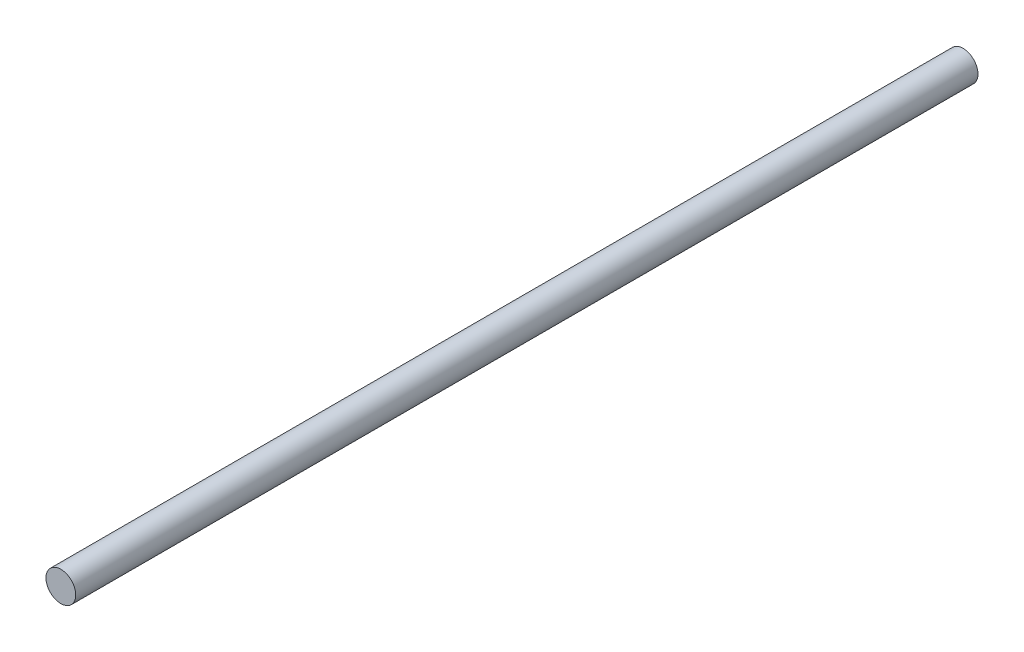
ISO-10303-21;
HEADER;
FILE_DESCRIPTION(('STEP AP214'),'2;1');
FILE_NAME('part.step','',(''),(''),'','','');
FILE_SCHEMA(('AUTOMOTIVE_DESIGN { 1 0 10303 214 1 1 1 1 }'));
ENDSEC;
DATA;
#1=APPLICATION_CONTEXT('core data for automotive mechanical design processes');
#2=APPLICATION_PROTOCOL_DEFINITION('international standard','automotive_design',2000,#1);
#3=PRODUCT_CONTEXT('',#1,'mechanical');
#4=PRODUCT('Part','Part','',(#3));
#5=PRODUCT_RELATED_PRODUCT_CATEGORY('part','',(#4));
#6=PRODUCT_DEFINITION_FORMATION('','',#4);
#7=PRODUCT_DEFINITION_CONTEXT('part definition',#1,'design');
#8=PRODUCT_DEFINITION('design','',#6,#7);
#9=PRODUCT_DEFINITION_SHAPE('','',#8);
#10=(LENGTH_UNIT() NAMED_UNIT(*) SI_UNIT(.MILLI.,.METRE.));
#11=(NAMED_UNIT(*) PLANE_ANGLE_UNIT() SI_UNIT($,.RADIAN.));
#12=(NAMED_UNIT(*) SI_UNIT($,.STERADIAN.) SOLID_ANGLE_UNIT());
#13=UNCERTAINTY_MEASURE_WITH_UNIT(LENGTH_MEASURE(1.E-05),#10,'distance_accuracy_value','');
#14=(GEOMETRIC_REPRESENTATION_CONTEXT(3) GLOBAL_UNCERTAINTY_ASSIGNED_CONTEXT((#13)) GLOBAL_UNIT_ASSIGNED_CONTEXT((#10,
#11,#12)) REPRESENTATION_CONTEXT('',''));
#15=CARTESIAN_POINT('',(0.,0.,0.));
#16=DIRECTION('',(0.,0.,1.));
#17=DIRECTION('',(1.,0.,0.));
#18=AXIS2_PLACEMENT_3D('',#15,#16,#17);
#19=CARTESIAN_POINT('',(0.,0.,303.));
#20=DIRECTION('',(0.,0.,-1.));
#21=DIRECTION('',(-1.,0.,0.));
#22=AXIS2_PLACEMENT_3D('',#19,#20,#21);
#23=CYLINDRICAL_SURFACE('',#22,5.);
#24=CARTESIAN_POINT('',(0.,0.,303.));
#25=DIRECTION('',(0.,0.,1.));
#26=DIRECTION('',(1.,0.,0.));
#27=AXIS2_PLACEMENT_3D('',#24,#25,#26);
#28=CIRCLE('',#27,5.);
#29=CARTESIAN_POINT('',(5.,0.,303.));
#30=VERTEX_POINT('',#29);
#31=EDGE_CURVE('E10',#30,#30,#28,.T.);
#32=ORIENTED_EDGE('',*,*,#31,.F.);
#33=EDGE_LOOP('',(#32));
#34=FACE_BOUND('',#33,.T.);
#35=CARTESIAN_POINT('',(0.,0.,0.));
#36=DIRECTION('',(0.,0.,1.));
#37=DIRECTION('',(1.,0.,0.));
#38=AXIS2_PLACEMENT_3D('',#35,#36,#37);
#39=CIRCLE('',#38,5.);
#40=CARTESIAN_POINT('',(5.,0.,0.));
#41=VERTEX_POINT('',#40);
#42=EDGE_CURVE('E34',#41,#41,#39,.T.);
#43=ORIENTED_EDGE('',*,*,#42,.T.);
#44=EDGE_LOOP('',(#43));
#45=FACE_BOUND('',#44,.T.);
#46=ADVANCED_FACE('F31',(#34,#45),#23,.T.);
#47=CARTESIAN_POINT('',(0.,0.,303.));
#48=DIRECTION('',(0.,0.,1.));
#49=DIRECTION('',(1.,0.,0.));
#50=AXIS2_PLACEMENT_3D('',#47,#48,#49);
#51=PLANE('',#50);
#52=ORIENTED_EDGE('',*,*,#31,.T.);
#53=EDGE_LOOP('',(#52));
#54=FACE_BOUND('',#53,.T.);
#55=ADVANCED_FACE('F46',(#54),#51,.T.);
#56=CARTESIAN_POINT('',(0.,0.,0.));
#57=DIRECTION('',(0.,0.,1.));
#58=DIRECTION('',(1.,0.,0.));
#59=AXIS2_PLACEMENT_3D('',#56,#57,#58);
#60=PLANE('',#59);
#61=ORIENTED_EDGE('',*,*,#42,.F.);
#62=EDGE_LOOP('',(#61));
#63=FACE_BOUND('',#62,.T.);
#64=ADVANCED_FACE('F44',(#63),#60,.F.);
#65=CLOSED_SHELL('',(#46,#55,#64));
#66=MANIFOLD_SOLID_BREP('B2',#65);
#67=ADVANCED_BREP_SHAPE_REPRESENTATION('',(#18,#66),#14);
#68=SHAPE_DEFINITION_REPRESENTATION(#9,#67);
ENDSEC;
END-ISO-10303-21;
